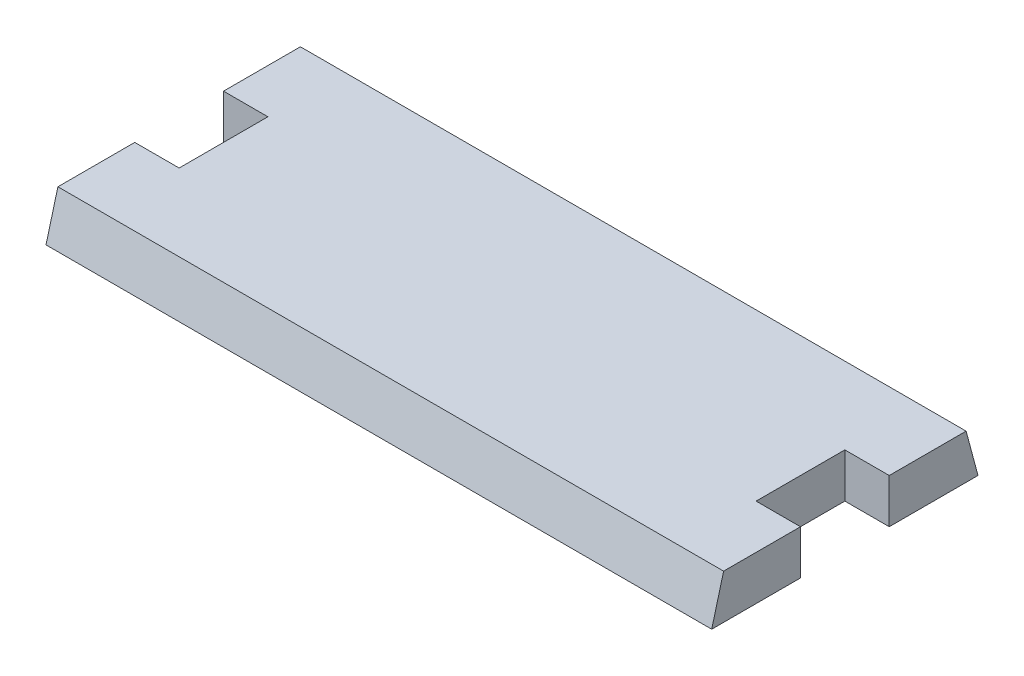
ISO-10303-21;
HEADER;
FILE_DESCRIPTION(('STEP AP214'),'2;1');
FILE_NAME('part.step','',(''),(''),'','','');
FILE_SCHEMA(('AUTOMOTIVE_DESIGN { 1 0 10303 214 1 1 1 1 }'));
ENDSEC;
DATA;
#1=APPLICATION_CONTEXT('core data for automotive mechanical design processes');
#2=APPLICATION_PROTOCOL_DEFINITION('international standard','automotive_design',2000,#1);
#3=PRODUCT_CONTEXT('',#1,'mechanical');
#4=PRODUCT('Part','Part','',(#3));
#5=PRODUCT_RELATED_PRODUCT_CATEGORY('part','',(#4));
#6=PRODUCT_DEFINITION_FORMATION('','',#4);
#7=PRODUCT_DEFINITION_CONTEXT('part definition',#1,'design');
#8=PRODUCT_DEFINITION('design','',#6,#7);
#9=PRODUCT_DEFINITION_SHAPE('','',#8);
#10=(LENGTH_UNIT() NAMED_UNIT(*) SI_UNIT(.MILLI.,.METRE.));
#11=(NAMED_UNIT(*) PLANE_ANGLE_UNIT() SI_UNIT($,.RADIAN.));
#12=(NAMED_UNIT(*) SI_UNIT($,.STERADIAN.) SOLID_ANGLE_UNIT());
#13=UNCERTAINTY_MEASURE_WITH_UNIT(LENGTH_MEASURE(1.E-05),#10,'distance_accuracy_value','');
#14=(GEOMETRIC_REPRESENTATION_CONTEXT(3) GLOBAL_UNCERTAINTY_ASSIGNED_CONTEXT((#13)) GLOBAL_UNIT_ASSIGNED_CONTEXT((#10,
#11,#12)) REPRESENTATION_CONTEXT('',''));
#15=CARTESIAN_POINT('',(0.,0.,0.));
#16=DIRECTION('',(0.,0.,1.));
#17=DIRECTION('',(1.,0.,0.));
#18=AXIS2_PLACEMENT_3D('',#15,#16,#17);
#19=CARTESIAN_POINT('',(-75.,10.,0.));
#20=DIRECTION('',(1.,0.,0.));
#21=DIRECTION('',(0.,0.,-1.));
#22=AXIS2_PLACEMENT_3D('',#19,#20,#21);
#23=PLANE('',#22);
#24=DIRECTION('',(0.,0.,1.));
#25=VECTOR('',#24,1.);
#26=CARTESIAN_POINT('',(-75.,0.,0.));
#27=LINE('',#26,#25);
#28=CARTESIAN_POINT('',(-75.,0.,-30.));
#29=VERTEX_POINT('',#28);
#30=CARTESIAN_POINT('',(-75.,0.,-10.));
#31=VERTEX_POINT('',#30);
#32=EDGE_CURVE('E173',#29,#31,#27,.T.);
#33=ORIENTED_EDGE('',*,*,#32,.T.);
#34=DIRECTION('',(0.,-1.,0.));
#35=VECTOR('',#34,1.);
#36=CARTESIAN_POINT('',(-75.,10.,-10.));
#37=LINE('',#36,#35);
#38=CARTESIAN_POINT('',(-75.,10.,-10.));
#39=VERTEX_POINT('',#38);
#40=EDGE_CURVE('E11',#39,#31,#37,.T.);
#41=ORIENTED_EDGE('',*,*,#40,.F.);
#42=DIRECTION('',(0.,0.,1.));
#43=VECTOR('',#42,1.);
#44=CARTESIAN_POINT('',(-75.,10.,0.));
#45=LINE('',#44,#43);
#46=CARTESIAN_POINT('',(-75.,10.,-27.3205080756888));
#47=VERTEX_POINT('',#46);
#48=EDGE_CURVE('E139',#47,#39,#45,.T.);
#49=ORIENTED_EDGE('',*,*,#48,.F.);
#50=DIRECTION('',(0.,-0.965925826289068,-0.258819045102521));
#51=VECTOR('',#50,1.);
#52=CARTESIAN_POINT('',(-75.,0.,-30.));
#53=LINE('',#52,#51);
#54=EDGE_CURVE('E52',#47,#29,#53,.T.);
#55=ORIENTED_EDGE('',*,*,#54,.T.);
#56=EDGE_LOOP('',(#33,#41,#49,#55));
#57=FACE_BOUND('',#56,.T.);
#58=ADVANCED_FACE('F33',(#57),#23,.F.);
#59=CARTESIAN_POINT('',(0.,10.,-9.99999999999997));
#60=DIRECTION('',(0.,0.,-1.));
#61=DIRECTION('',(-1.,0.,0.));
#62=AXIS2_PLACEMENT_3D('',#59,#60,#61);
#63=PLANE('',#62);
#64=DIRECTION('',(1.,0.,0.));
#65=VECTOR('',#64,1.);
#66=CARTESIAN_POINT('',(0.,0.,-9.99999999999997));
#67=LINE('',#66,#65);
#68=CARTESIAN_POINT('',(-65.,0.,-10.));
#69=VERTEX_POINT('',#68);
#70=EDGE_CURVE('E144',#31,#69,#67,.T.);
#71=ORIENTED_EDGE('',*,*,#70,.T.);
#72=DIRECTION('',(0.,-1.,0.));
#73=VECTOR('',#72,1.);
#74=CARTESIAN_POINT('',(-65.,10.,-10.));
#75=LINE('',#74,#73);
#76=CARTESIAN_POINT('',(-65.,10.,-10.));
#77=VERTEX_POINT('',#76);
#78=EDGE_CURVE('E43',#77,#69,#75,.T.);
#79=ORIENTED_EDGE('',*,*,#78,.F.);
#80=DIRECTION('',(1.,0.,0.));
#81=VECTOR('',#80,1.);
#82=CARTESIAN_POINT('',(0.,10.,-9.99999999999997));
#83=LINE('',#82,#81);
#84=EDGE_CURVE('E132',#39,#77,#83,.T.);
#85=ORIENTED_EDGE('',*,*,#84,.F.);
#86=ORIENTED_EDGE('',*,*,#40,.T.);
#87=EDGE_LOOP('',(#71,#79,#85,#86));
#88=FACE_BOUND('',#87,.T.);
#89=ADVANCED_FACE('F143',(#88),#63,.F.);
#90=CARTESIAN_POINT('',(-65.,10.,0.));
#91=DIRECTION('',(1.,0.,0.));
#92=DIRECTION('',(0.,0.,-1.));
#93=AXIS2_PLACEMENT_3D('',#90,#91,#92);
#94=PLANE('',#93);
#95=DIRECTION('',(0.,0.,1.));
#96=VECTOR('',#95,1.);
#97=CARTESIAN_POINT('',(-65.,0.,0.));
#98=LINE('',#97,#96);
#99=CARTESIAN_POINT('',(-65.,0.,10.));
#100=VERTEX_POINT('',#99);
#101=EDGE_CURVE('E176',#69,#100,#98,.T.);
#102=ORIENTED_EDGE('',*,*,#101,.T.);
#103=DIRECTION('',(0.,-1.,0.));
#104=VECTOR('',#103,1.);
#105=CARTESIAN_POINT('',(-65.,10.,10.));
#106=LINE('',#105,#104);
#107=CARTESIAN_POINT('',(-65.,10.,10.));
#108=VERTEX_POINT('',#107);
#109=EDGE_CURVE('E148',#108,#100,#106,.T.);
#110=ORIENTED_EDGE('',*,*,#109,.F.);
#111=DIRECTION('',(0.,0.,1.));
#112=VECTOR('',#111,1.);
#113=CARTESIAN_POINT('',(-65.,10.,0.));
#114=LINE('',#113,#112);
#115=EDGE_CURVE('E136',#77,#108,#114,.T.);
#116=ORIENTED_EDGE('',*,*,#115,.F.);
#117=ORIENTED_EDGE('',*,*,#78,.T.);
#118=EDGE_LOOP('',(#102,#110,#116,#117));
#119=FACE_BOUND('',#118,.T.);
#120=ADVANCED_FACE('F150',(#119),#94,.F.);
#121=CARTESIAN_POINT('',(0.,10.,9.99999999999999));
#122=DIRECTION('',(0.,0.,-1.));
#123=DIRECTION('',(-1.,0.,0.));
#124=AXIS2_PLACEMENT_3D('',#121,#122,#123);
#125=PLANE('',#124);
#126=DIRECTION('',(1.,0.,0.));
#127=VECTOR('',#126,1.);
#128=CARTESIAN_POINT('',(0.,0.,9.99999999999999));
#129=LINE('',#128,#127);
#130=CARTESIAN_POINT('',(-75.,0.,10.));
#131=VERTEX_POINT('',#130);
#132=EDGE_CURVE('E178',#131,#100,#129,.T.);
#133=ORIENTED_EDGE('',*,*,#132,.F.);
#134=DIRECTION('',(0.,-1.,0.));
#135=VECTOR('',#134,1.);
#136=CARTESIAN_POINT('',(-75.,10.,10.));
#137=LINE('',#136,#135);
#138=CARTESIAN_POINT('',(-75.,10.,10.));
#139=VERTEX_POINT('',#138);
#140=EDGE_CURVE('E75',#139,#131,#137,.T.);
#141=ORIENTED_EDGE('',*,*,#140,.F.);
#142=DIRECTION('',(1.,0.,0.));
#143=VECTOR('',#142,1.);
#144=CARTESIAN_POINT('',(0.,10.,9.99999999999999));
#145=LINE('',#144,#143);
#146=EDGE_CURVE('E151',#139,#108,#145,.T.);
#147=ORIENTED_EDGE('',*,*,#146,.T.);
#148=ORIENTED_EDGE('',*,*,#109,.T.);
#149=EDGE_LOOP('',(#133,#141,#147,#148));
#150=FACE_BOUND('',#149,.T.);
#151=ADVANCED_FACE('F277',(#150),#125,.T.);
#152=CARTESIAN_POINT('',(-75.,10.,0.));
#153=DIRECTION('',(1.,0.,0.));
#154=DIRECTION('',(0.,0.,-1.));
#155=AXIS2_PLACEMENT_3D('',#152,#153,#154);
#156=PLANE('',#155);
#157=DIRECTION('',(0.,0.,1.));
#158=VECTOR('',#157,1.);
#159=CARTESIAN_POINT('',(-75.,0.,0.));
#160=LINE('',#159,#158);
#161=CARTESIAN_POINT('',(-75.,0.,30.));
#162=VERTEX_POINT('',#161);
#163=EDGE_CURVE('E181',#131,#162,#160,.T.);
#164=ORIENTED_EDGE('',*,*,#163,.T.);
#165=DIRECTION('',(0.,0.965925826289068,-0.258819045102521));
#166=VECTOR('',#165,1.);
#167=CARTESIAN_POINT('',(-75.,0.,30.));
#168=LINE('',#167,#166);
#169=CARTESIAN_POINT('',(-75.,10.,27.3205080756888));
#170=VERTEX_POINT('',#169);
#171=EDGE_CURVE('E214',#170,#162,#168,.F.);
#172=ORIENTED_EDGE('',*,*,#171,.F.);
#173=DIRECTION('',(0.,0.,1.));
#174=VECTOR('',#173,1.);
#175=CARTESIAN_POINT('',(-75.,10.,0.));
#176=LINE('',#175,#174);
#177=EDGE_CURVE('E65',#139,#170,#176,.T.);
#178=ORIENTED_EDGE('',*,*,#177,.F.);
#179=ORIENTED_EDGE('',*,*,#140,.T.);
#180=EDGE_LOOP('',(#164,#172,#178,#179));
#181=FACE_BOUND('',#180,.T.);
#182=ADVANCED_FACE('F274',(#181),#156,.F.);
#183=CARTESIAN_POINT('',(0.,0.,30.));
#184=DIRECTION('',(0.,0.258819045102521,0.965925826289068));
#185=DIRECTION('',(0.,-0.965925826289068,0.258819045102521));
#186=AXIS2_PLACEMENT_3D('',#183,#184,#185);
#187=PLANE('',#186);
#188=DIRECTION('',(1.,0.,0.));
#189=VECTOR('',#188,1.);
#190=CARTESIAN_POINT('',(0.,0.,30.));
#191=LINE('',#190,#189);
#192=CARTESIAN_POINT('',(75.,0.,30.));
#193=VERTEX_POINT('',#192);
#194=EDGE_CURVE('E183',#162,#193,#191,.T.);
#195=ORIENTED_EDGE('',*,*,#194,.T.);
#196=DIRECTION('',(0.,0.965925826289068,-0.258819045102521));
#197=VECTOR('',#196,1.);
#198=CARTESIAN_POINT('',(75.,0.,30.));
#199=LINE('',#198,#197);
#200=CARTESIAN_POINT('',(75.,10.,27.3205080756888));
#201=VERTEX_POINT('',#200);
#202=EDGE_CURVE('E37',#201,#193,#199,.F.);
#203=ORIENTED_EDGE('',*,*,#202,.F.);
#204=DIRECTION('',(-1.,0.,0.));
#205=VECTOR('',#204,1.);
#206=CARTESIAN_POINT('',(0.,10.,27.3205080756888));
#207=LINE('',#206,#205);
#208=EDGE_CURVE('E157',#170,#201,#207,.F.);
#209=ORIENTED_EDGE('',*,*,#208,.F.);
#210=ORIENTED_EDGE('',*,*,#171,.T.);
#211=EDGE_LOOP('',(#195,#203,#209,#210));
#212=FACE_BOUND('',#211,.T.);
#213=ADVANCED_FACE('F35',(#212),#187,.T.);
#214=CARTESIAN_POINT('',(75.,10.,0.));
#215=DIRECTION('',(1.,0.,0.));
#216=DIRECTION('',(0.,0.,-1.));
#217=AXIS2_PLACEMENT_3D('',#214,#215,#216);
#218=PLANE('',#217);
#219=DIRECTION('',(0.,0.,1.));
#220=VECTOR('',#219,1.);
#221=CARTESIAN_POINT('',(75.,0.,0.));
#222=LINE('',#221,#220);
#223=CARTESIAN_POINT('',(75.,0.,10.));
#224=VERTEX_POINT('',#223);
#225=EDGE_CURVE('E186',#224,#193,#222,.T.);
#226=ORIENTED_EDGE('',*,*,#225,.F.);
#227=DIRECTION('',(0.,-1.,0.));
#228=VECTOR('',#227,1.);
#229=CARTESIAN_POINT('',(75.,10.,10.));
#230=LINE('',#229,#228);
#231=CARTESIAN_POINT('',(75.,10.,10.));
#232=VERTEX_POINT('',#231);
#233=EDGE_CURVE('E211',#232,#224,#230,.T.);
#234=ORIENTED_EDGE('',*,*,#233,.F.);
#235=DIRECTION('',(0.,0.,1.));
#236=VECTOR('',#235,1.);
#237=CARTESIAN_POINT('',(75.,10.,0.));
#238=LINE('',#237,#236);
#239=EDGE_CURVE('E158',#232,#201,#238,.T.);
#240=ORIENTED_EDGE('',*,*,#239,.T.);
#241=ORIENTED_EDGE('',*,*,#202,.T.);
#242=EDGE_LOOP('',(#226,#234,#240,#241));
#243=FACE_BOUND('',#242,.T.);
#244=ADVANCED_FACE('F227',(#243),#218,.T.);
#245=CARTESIAN_POINT('',(0.,10.,9.99999999999999));
#246=DIRECTION('',(0.,0.,1.));
#247=DIRECTION('',(1.,0.,0.));
#248=AXIS2_PLACEMENT_3D('',#245,#246,#247);
#249=PLANE('',#248);
#250=DIRECTION('',(-1.,0.,0.));
#251=VECTOR('',#250,1.);
#252=CARTESIAN_POINT('',(0.,0.,9.99999999999999));
#253=LINE('',#252,#251);
#254=CARTESIAN_POINT('',(65.,0.,10.));
#255=VERTEX_POINT('',#254);
#256=EDGE_CURVE('E189',#224,#255,#253,.T.);
#257=ORIENTED_EDGE('',*,*,#256,.T.);
#258=DIRECTION('',(0.,-1.,0.));
#259=VECTOR('',#258,1.);
#260=CARTESIAN_POINT('',(65.,10.,10.));
#261=LINE('',#260,#259);
#262=CARTESIAN_POINT('',(65.,10.,10.));
#263=VERTEX_POINT('',#262);
#264=EDGE_CURVE('E209',#263,#255,#261,.T.);
#265=ORIENTED_EDGE('',*,*,#264,.F.);
#266=DIRECTION('',(-1.,0.,0.));
#267=VECTOR('',#266,1.);
#268=CARTESIAN_POINT('',(0.,10.,9.99999999999999));
#269=LINE('',#268,#267);
#270=EDGE_CURVE('E161',#232,#263,#269,.T.);
#271=ORIENTED_EDGE('',*,*,#270,.F.);
#272=ORIENTED_EDGE('',*,*,#233,.T.);
#273=EDGE_LOOP('',(#257,#265,#271,#272));
#274=FACE_BOUND('',#273,.T.);
#275=ADVANCED_FACE('F232',(#274),#249,.F.);
#276=CARTESIAN_POINT('',(65.,10.,0.));
#277=DIRECTION('',(1.,0.,0.));
#278=DIRECTION('',(0.,0.,-1.));
#279=AXIS2_PLACEMENT_3D('',#276,#277,#278);
#280=PLANE('',#279);
#281=DIRECTION('',(0.,0.,1.));
#282=VECTOR('',#281,1.);
#283=CARTESIAN_POINT('',(65.,0.,0.));
#284=LINE('',#283,#282);
#285=CARTESIAN_POINT('',(65.,0.,-10.));
#286=VERTEX_POINT('',#285);
#287=EDGE_CURVE('E192',#286,#255,#284,.T.);
#288=ORIENTED_EDGE('',*,*,#287,.F.);
#289=DIRECTION('',(0.,-1.,0.));
#290=VECTOR('',#289,1.);
#291=CARTESIAN_POINT('',(65.,10.,-10.));
#292=LINE('',#291,#290);
#293=CARTESIAN_POINT('',(65.,10.,-10.));
#294=VERTEX_POINT('',#293);
#295=EDGE_CURVE('E206',#294,#286,#292,.T.);
#296=ORIENTED_EDGE('',*,*,#295,.F.);
#297=DIRECTION('',(0.,0.,1.));
#298=VECTOR('',#297,1.);
#299=CARTESIAN_POINT('',(65.,10.,0.));
#300=LINE('',#299,#298);
#301=EDGE_CURVE('E163',#294,#263,#300,.T.);
#302=ORIENTED_EDGE('',*,*,#301,.T.);
#303=ORIENTED_EDGE('',*,*,#264,.T.);
#304=EDGE_LOOP('',(#288,#296,#302,#303));
#305=FACE_BOUND('',#304,.T.);
#306=ADVANCED_FACE('F264',(#305),#280,.T.);
#307=CARTESIAN_POINT('',(0.,10.,-9.99999999999997));
#308=DIRECTION('',(0.,0.,1.));
#309=DIRECTION('',(1.,0.,0.));
#310=AXIS2_PLACEMENT_3D('',#307,#308,#309);
#311=PLANE('',#310);
#312=DIRECTION('',(-1.,0.,0.));
#313=VECTOR('',#312,1.);
#314=CARTESIAN_POINT('',(0.,0.,-9.99999999999997));
#315=LINE('',#314,#313);
#316=CARTESIAN_POINT('',(75.,0.,-10.));
#317=VERTEX_POINT('',#316);
#318=EDGE_CURVE('E195',#317,#286,#315,.T.);
#319=ORIENTED_EDGE('',*,*,#318,.F.);
#320=DIRECTION('',(0.,-1.,0.));
#321=VECTOR('',#320,1.);
#322=CARTESIAN_POINT('',(75.,10.,-10.));
#323=LINE('',#322,#321);
#324=CARTESIAN_POINT('',(75.,10.,-10.));
#325=VERTEX_POINT('',#324);
#326=EDGE_CURVE('E204',#325,#317,#323,.T.);
#327=ORIENTED_EDGE('',*,*,#326,.F.);
#328=DIRECTION('',(-1.,0.,0.));
#329=VECTOR('',#328,1.);
#330=CARTESIAN_POINT('',(0.,10.,-9.99999999999997));
#331=LINE('',#330,#329);
#332=EDGE_CURVE('E166',#325,#294,#331,.T.);
#333=ORIENTED_EDGE('',*,*,#332,.T.);
#334=ORIENTED_EDGE('',*,*,#295,.T.);
#335=EDGE_LOOP('',(#319,#327,#333,#334));
#336=FACE_BOUND('',#335,.T.);
#337=ADVANCED_FACE('F239',(#336),#311,.T.);
#338=CARTESIAN_POINT('',(75.,10.,0.));
#339=DIRECTION('',(1.,0.,0.));
#340=DIRECTION('',(0.,0.,-1.));
#341=AXIS2_PLACEMENT_3D('',#338,#339,#340);
#342=PLANE('',#341);
#343=DIRECTION('',(0.,0.,1.));
#344=VECTOR('',#343,1.);
#345=CARTESIAN_POINT('',(75.,0.,0.));
#346=LINE('',#345,#344);
#347=CARTESIAN_POINT('',(75.,0.,-30.));
#348=VERTEX_POINT('',#347);
#349=EDGE_CURVE('E198',#348,#317,#346,.T.);
#350=ORIENTED_EDGE('',*,*,#349,.F.);
#351=DIRECTION('',(0.,-0.965925826289068,-0.258819045102521));
#352=VECTOR('',#351,1.);
#353=CARTESIAN_POINT('',(75.,0.,-30.));
#354=LINE('',#353,#352);
#355=CARTESIAN_POINT('',(75.,10.,-27.3205080756888));
#356=VERTEX_POINT('',#355);
#357=EDGE_CURVE('E207',#356,#348,#354,.T.);
#358=ORIENTED_EDGE('',*,*,#357,.F.);
#359=DIRECTION('',(0.,0.,1.));
#360=VECTOR('',#359,1.);
#361=CARTESIAN_POINT('',(75.,10.,0.));
#362=LINE('',#361,#360);
#363=EDGE_CURVE('E169',#356,#325,#362,.T.);
#364=ORIENTED_EDGE('',*,*,#363,.T.);
#365=ORIENTED_EDGE('',*,*,#326,.T.);
#366=EDGE_LOOP('',(#350,#358,#364,#365));
#367=FACE_BOUND('',#366,.T.);
#368=ADVANCED_FACE('F243',(#367),#342,.T.);
#369=CARTESIAN_POINT('',(0.,0.,-30.));
#370=DIRECTION('',(0.,0.258819045102521,-0.965925826289068));
#371=DIRECTION('',(0.,0.965925826289068,0.258819045102521));
#372=AXIS2_PLACEMENT_3D('',#369,#370,#371);
#373=PLANE('',#372);
#374=DIRECTION('',(1.,0.,0.));
#375=VECTOR('',#374,1.);
#376=CARTESIAN_POINT('',(0.,0.,-30.));
#377=LINE('',#376,#375);
#378=EDGE_CURVE('E201',#29,#348,#377,.T.);
#379=ORIENTED_EDGE('',*,*,#378,.F.);
#380=ORIENTED_EDGE('',*,*,#54,.F.);
#381=DIRECTION('',(1.,0.,0.));
#382=VECTOR('',#381,1.);
#383=CARTESIAN_POINT('',(0.,10.,-27.3205080756888));
#384=LINE('',#383,#382);
#385=EDGE_CURVE('E172',#47,#356,#384,.T.);
#386=ORIENTED_EDGE('',*,*,#385,.T.);
#387=ORIENTED_EDGE('',*,*,#357,.T.);
#388=EDGE_LOOP('',(#379,#380,#386,#387));
#389=FACE_BOUND('',#388,.T.);
#390=ADVANCED_FACE('F244',(#389),#373,.T.);
#391=CARTESIAN_POINT('',(0.,10.,0.));
#392=DIRECTION('',(0.,1.,0.));
#393=DIRECTION('',(0.,0.,1.));
#394=AXIS2_PLACEMENT_3D('',#391,#392,#393);
#395=PLANE('',#394);
#396=ORIENTED_EDGE('',*,*,#48,.T.);
#397=ORIENTED_EDGE('',*,*,#84,.T.);
#398=ORIENTED_EDGE('',*,*,#115,.T.);
#399=ORIENTED_EDGE('',*,*,#146,.F.);
#400=ORIENTED_EDGE('',*,*,#177,.T.);
#401=ORIENTED_EDGE('',*,*,#208,.T.);
#402=ORIENTED_EDGE('',*,*,#239,.F.);
#403=ORIENTED_EDGE('',*,*,#270,.T.);
#404=ORIENTED_EDGE('',*,*,#301,.F.);
#405=ORIENTED_EDGE('',*,*,#332,.F.);
#406=ORIENTED_EDGE('',*,*,#363,.F.);
#407=ORIENTED_EDGE('',*,*,#385,.F.);
#408=EDGE_LOOP('',(#396,#397,#398,#399,#400,#401,#402,#403,#404,#405,#406,#407));
#409=FACE_BOUND('',#408,.T.);
#410=ADVANCED_FACE('F134',(#409),#395,.T.);
#411=CARTESIAN_POINT('',(0.,0.,0.));
#412=DIRECTION('',(0.,1.,0.));
#413=DIRECTION('',(0.,0.,1.));
#414=AXIS2_PLACEMENT_3D('',#411,#412,#413);
#415=PLANE('',#414);
#416=ORIENTED_EDGE('',*,*,#32,.F.);
#417=ORIENTED_EDGE('',*,*,#378,.T.);
#418=ORIENTED_EDGE('',*,*,#349,.T.);
#419=ORIENTED_EDGE('',*,*,#318,.T.);
#420=ORIENTED_EDGE('',*,*,#287,.T.);
#421=ORIENTED_EDGE('',*,*,#256,.F.);
#422=ORIENTED_EDGE('',*,*,#225,.T.);
#423=ORIENTED_EDGE('',*,*,#194,.F.);
#424=ORIENTED_EDGE('',*,*,#163,.F.);
#425=ORIENTED_EDGE('',*,*,#132,.T.);
#426=ORIENTED_EDGE('',*,*,#101,.F.);
#427=ORIENTED_EDGE('',*,*,#70,.F.);
#428=EDGE_LOOP('',(#416,#417,#418,#419,#420,#421,#422,#423,#424,#425,#426,#427));
#429=FACE_BOUND('',#428,.T.);
#430=ADVANCED_FACE('F246',(#429),#415,.F.);
#431=CLOSED_SHELL('',(#58,#89,#120,#151,#182,#213,#244,#275,#306,#337,#368,#390,#410,#430));
#432=MANIFOLD_SOLID_BREP('B2',#431);
#433=ADVANCED_BREP_SHAPE_REPRESENTATION('',(#18,#432),#14);
#434=SHAPE_DEFINITION_REPRESENTATION(#9,#433);
ENDSEC;
END-ISO-10303-21;
